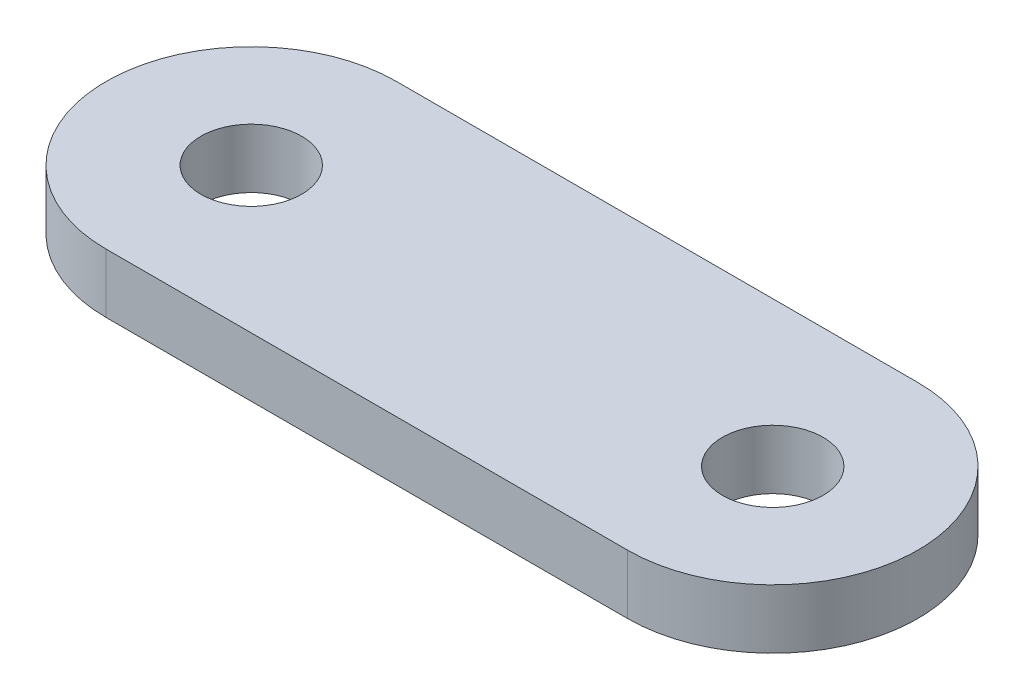
ISO-10303-21;
HEADER;
FILE_DESCRIPTION(('STEP AP214'),'2;1');
FILE_NAME('part.step','',(''),(''),'','','');
FILE_SCHEMA(('AUTOMOTIVE_DESIGN { 1 0 10303 214 1 1 1 1 }'));
ENDSEC;
DATA;
#1=APPLICATION_CONTEXT('core data for automotive mechanical design processes');
#2=APPLICATION_PROTOCOL_DEFINITION('international standard','automotive_design',2000,#1);
#3=PRODUCT_CONTEXT('',#1,'mechanical');
#4=PRODUCT('Part','Part','',(#3));
#5=PRODUCT_RELATED_PRODUCT_CATEGORY('part','',(#4));
#6=PRODUCT_DEFINITION_FORMATION('','',#4);
#7=PRODUCT_DEFINITION_CONTEXT('part definition',#1,'design');
#8=PRODUCT_DEFINITION('design','',#6,#7);
#9=PRODUCT_DEFINITION_SHAPE('','',#8);
#10=(LENGTH_UNIT() NAMED_UNIT(*) SI_UNIT(.MILLI.,.METRE.));
#11=(NAMED_UNIT(*) PLANE_ANGLE_UNIT() SI_UNIT($,.RADIAN.));
#12=(NAMED_UNIT(*) SI_UNIT($,.STERADIAN.) SOLID_ANGLE_UNIT());
#13=UNCERTAINTY_MEASURE_WITH_UNIT(LENGTH_MEASURE(1.E-05),#10,'distance_accuracy_value','');
#14=(GEOMETRIC_REPRESENTATION_CONTEXT(3) GLOBAL_UNCERTAINTY_ASSIGNED_CONTEXT((#13)) GLOBAL_UNIT_ASSIGNED_CONTEXT((#10,
#11,#12)) REPRESENTATION_CONTEXT('',''));
#15=CARTESIAN_POINT('',(0.,0.,0.));
#16=DIRECTION('',(0.,0.,1.));
#17=DIRECTION('',(1.,0.,0.));
#18=AXIS2_PLACEMENT_3D('',#15,#16,#17);
#19=CARTESIAN_POINT('',(0.,2.,0.));
#20=DIRECTION('',(0.,1.,0.));
#21=DIRECTION('',(0.,0.,1.));
#22=AXIS2_PLACEMENT_3D('',#19,#20,#21);
#23=PLANE('',#22);
#24=CARTESIAN_POINT('',(0.,2.,0.));
#25=DIRECTION('',(0.,1.,0.));
#26=DIRECTION('',(0.,0.,1.));
#27=AXIS2_PLACEMENT_3D('',#24,#25,#26);
#28=CIRCLE('',#27,1.7);
#29=CARTESIAN_POINT('',(0.,2.,1.7));
#30=VERTEX_POINT('',#29);
#31=EDGE_CURVE('E100',#30,#30,#28,.T.);
#32=ORIENTED_EDGE('',*,*,#31,.F.);
#33=EDGE_LOOP('',(#32));
#34=FACE_BOUND('',#33,.T.);
#35=CARTESIAN_POINT('',(0.,2.,0.));
#36=DIRECTION('',(0.,1.,0.));
#37=DIRECTION('',(0.,0.,1.));
#38=AXIS2_PLACEMENT_3D('',#35,#36,#37);
#39=CIRCLE('',#38,4.9);
#40=CARTESIAN_POINT('',(0.,2.,-4.9));
#41=VERTEX_POINT('',#40);
#42=CARTESIAN_POINT('',(0.,2.,4.9));
#43=VERTEX_POINT('',#42);
#44=EDGE_CURVE('E85',#41,#43,#39,.T.);
#45=ORIENTED_EDGE('',*,*,#44,.T.);
#46=DIRECTION('',(1.,0.,0.));
#47=VECTOR('',#46,1.);
#48=CARTESIAN_POINT('',(0.,2.,4.9));
#49=LINE('',#48,#47);
#50=CARTESIAN_POINT('',(17.6,2.,4.9));
#51=VERTEX_POINT('',#50);
#52=EDGE_CURVE('E80',#43,#51,#49,.T.);
#53=ORIENTED_EDGE('',*,*,#52,.T.);
#54=CARTESIAN_POINT('',(17.6,2.,0.));
#55=DIRECTION('',(0.,1.,0.));
#56=DIRECTION('',(0.,0.,1.));
#57=AXIS2_PLACEMENT_3D('',#54,#55,#56);
#58=CIRCLE('',#57,4.9);
#59=CARTESIAN_POINT('',(17.6,2.,-4.9));
#60=VERTEX_POINT('',#59);
#61=EDGE_CURVE('E83',#51,#60,#58,.T.);
#62=ORIENTED_EDGE('',*,*,#61,.T.);
#63=DIRECTION('',(-1.,0.,0.));
#64=VECTOR('',#63,1.);
#65=CARTESIAN_POINT('',(0.,2.,-4.9));
#66=LINE('',#65,#64);
#67=EDGE_CURVE('E50',#60,#41,#66,.T.);
#68=ORIENTED_EDGE('',*,*,#67,.T.);
#69=EDGE_LOOP('',(#45,#53,#62,#68));
#70=FACE_BOUND('',#69,.T.);
#71=CARTESIAN_POINT('',(17.6,2.,0.));
#72=DIRECTION('',(0.,1.,0.));
#73=DIRECTION('',(0.,0.,1.));
#74=AXIS2_PLACEMENT_3D('',#71,#72,#73);
#75=CIRCLE('',#74,1.7);
#76=CARTESIAN_POINT('',(17.6,2.,1.7));
#77=VERTEX_POINT('',#76);
#78=EDGE_CURVE('E115',#77,#77,#75,.T.);
#79=ORIENTED_EDGE('',*,*,#78,.F.);
#80=EDGE_LOOP('',(#79));
#81=FACE_BOUND('',#80,.T.);
#82=ADVANCED_FACE('F33',(#34,#70,#81),#23,.T.);
#83=CARTESIAN_POINT('',(0.,0.,0.));
#84=DIRECTION('',(0.,1.,0.));
#85=DIRECTION('',(0.,0.,1.));
#86=AXIS2_PLACEMENT_3D('',#83,#84,#85);
#87=PLANE('',#86);
#88=CARTESIAN_POINT('',(0.,0.,0.));
#89=DIRECTION('',(0.,1.,0.));
#90=DIRECTION('',(0.,0.,1.));
#91=AXIS2_PLACEMENT_3D('',#88,#89,#90);
#92=CIRCLE('',#91,4.9);
#93=CARTESIAN_POINT('',(0.,0.,-4.9));
#94=VERTEX_POINT('',#93);
#95=CARTESIAN_POINT('',(0.,0.,4.9));
#96=VERTEX_POINT('',#95);
#97=EDGE_CURVE('E97',#94,#96,#92,.T.);
#98=ORIENTED_EDGE('',*,*,#97,.F.);
#99=DIRECTION('',(-1.,0.,0.));
#100=VECTOR('',#99,1.);
#101=CARTESIAN_POINT('',(0.,0.,-4.9));
#102=LINE('',#101,#100);
#103=CARTESIAN_POINT('',(17.6,0.,-4.9));
#104=VERTEX_POINT('',#103);
#105=EDGE_CURVE('E73',#104,#94,#102,.T.);
#106=ORIENTED_EDGE('',*,*,#105,.F.);
#107=CARTESIAN_POINT('',(17.6,0.,0.));
#108=DIRECTION('',(0.,1.,0.));
#109=DIRECTION('',(0.,0.,1.));
#110=AXIS2_PLACEMENT_3D('',#107,#108,#109);
#111=CIRCLE('',#110,4.9);
#112=CARTESIAN_POINT('',(17.6,0.,4.9));
#113=VERTEX_POINT('',#112);
#114=EDGE_CURVE('E67',#113,#104,#111,.T.);
#115=ORIENTED_EDGE('',*,*,#114,.F.);
#116=DIRECTION('',(1.,0.,0.));
#117=VECTOR('',#116,1.);
#118=CARTESIAN_POINT('',(0.,0.,4.9));
#119=LINE('',#118,#117);
#120=EDGE_CURVE('E89',#96,#113,#119,.T.);
#121=ORIENTED_EDGE('',*,*,#120,.F.);
#122=EDGE_LOOP('',(#98,#106,#115,#121));
#123=FACE_BOUND('',#122,.T.);
#124=CARTESIAN_POINT('',(0.,0.,0.));
#125=DIRECTION('',(0.,1.,0.));
#126=DIRECTION('',(0.,0.,1.));
#127=AXIS2_PLACEMENT_3D('',#124,#125,#126);
#128=CIRCLE('',#127,1.7);
#129=CARTESIAN_POINT('',(0.,0.,1.7));
#130=VERTEX_POINT('',#129);
#131=EDGE_CURVE('E112',#130,#130,#128,.T.);
#132=ORIENTED_EDGE('',*,*,#131,.T.);
#133=EDGE_LOOP('',(#132));
#134=FACE_BOUND('',#133,.T.);
#135=CARTESIAN_POINT('',(17.6,0.,0.));
#136=DIRECTION('',(0.,1.,0.));
#137=DIRECTION('',(0.,0.,1.));
#138=AXIS2_PLACEMENT_3D('',#135,#136,#137);
#139=CIRCLE('',#138,1.7);
#140=CARTESIAN_POINT('',(17.6,0.,1.7));
#141=VERTEX_POINT('',#140);
#142=EDGE_CURVE('E118',#141,#141,#139,.T.);
#143=ORIENTED_EDGE('',*,*,#142,.T.);
#144=EDGE_LOOP('',(#143));
#145=FACE_BOUND('',#144,.T.);
#146=ADVANCED_FACE('F108',(#123,#134,#145),#87,.F.);
#147=CARTESIAN_POINT('',(0.,2.,0.));
#148=DIRECTION('',(0.,-1.,0.));
#149=DIRECTION('',(0.,0.,-1.));
#150=AXIS2_PLACEMENT_3D('',#147,#148,#149);
#151=CYLINDRICAL_SURFACE('',#150,4.9);
#152=ORIENTED_EDGE('',*,*,#97,.T.);
#153=DIRECTION('',(0.,-1.,0.));
#154=VECTOR('',#153,1.);
#155=CARTESIAN_POINT('',(0.,2.,4.9));
#156=LINE('',#155,#154);
#157=EDGE_CURVE('E11',#43,#96,#156,.T.);
#158=ORIENTED_EDGE('',*,*,#157,.F.);
#159=ORIENTED_EDGE('',*,*,#44,.F.);
#160=DIRECTION('',(0.,-1.,0.));
#161=VECTOR('',#160,1.);
#162=CARTESIAN_POINT('',(0.,2.,-4.9));
#163=LINE('',#162,#161);
#164=EDGE_CURVE('E93',#41,#94,#163,.T.);
#165=ORIENTED_EDGE('',*,*,#164,.T.);
#166=EDGE_LOOP('',(#152,#158,#159,#165));
#167=FACE_BOUND('',#166,.T.);
#168=ADVANCED_FACE('F35',(#167),#151,.T.);
#169=CARTESIAN_POINT('',(0.,2.,4.9));
#170=DIRECTION('',(0.,0.,-1.));
#171=DIRECTION('',(-1.,0.,0.));
#172=AXIS2_PLACEMENT_3D('',#169,#170,#171);
#173=PLANE('',#172);
#174=ORIENTED_EDGE('',*,*,#120,.T.);
#175=DIRECTION('',(0.,-1.,0.));
#176=VECTOR('',#175,1.);
#177=CARTESIAN_POINT('',(17.6,2.,4.9));
#178=LINE('',#177,#176);
#179=EDGE_CURVE('E42',#51,#113,#178,.T.);
#180=ORIENTED_EDGE('',*,*,#179,.F.);
#181=ORIENTED_EDGE('',*,*,#52,.F.);
#182=ORIENTED_EDGE('',*,*,#157,.T.);
#183=EDGE_LOOP('',(#174,#180,#181,#182));
#184=FACE_BOUND('',#183,.T.);
#185=ADVANCED_FACE('F88',(#184),#173,.F.);
#186=CARTESIAN_POINT('',(17.6,2.,0.));
#187=DIRECTION('',(0.,-1.,0.));
#188=DIRECTION('',(0.,0.,-1.));
#189=AXIS2_PLACEMENT_3D('',#186,#187,#188);
#190=CYLINDRICAL_SURFACE('',#189,4.9);
#191=ORIENTED_EDGE('',*,*,#114,.T.);
#192=DIRECTION('',(0.,-1.,0.));
#193=VECTOR('',#192,1.);
#194=CARTESIAN_POINT('',(17.6,2.,-4.9));
#195=LINE('',#194,#193);
#196=EDGE_CURVE('E90',#60,#104,#195,.T.);
#197=ORIENTED_EDGE('',*,*,#196,.F.);
#198=ORIENTED_EDGE('',*,*,#61,.F.);
#199=ORIENTED_EDGE('',*,*,#179,.T.);
#200=EDGE_LOOP('',(#191,#197,#198,#199));
#201=FACE_BOUND('',#200,.T.);
#202=ADVANCED_FACE('F91',(#201),#190,.T.);
#203=CARTESIAN_POINT('',(0.,2.,-4.9));
#204=DIRECTION('',(0.,0.,1.));
#205=DIRECTION('',(1.,0.,0.));
#206=AXIS2_PLACEMENT_3D('',#203,#204,#205);
#207=PLANE('',#206);
#208=ORIENTED_EDGE('',*,*,#105,.T.);
#209=ORIENTED_EDGE('',*,*,#164,.F.);
#210=ORIENTED_EDGE('',*,*,#67,.F.);
#211=ORIENTED_EDGE('',*,*,#196,.T.);
#212=EDGE_LOOP('',(#208,#209,#210,#211));
#213=FACE_BOUND('',#212,.T.);
#214=ADVANCED_FACE('F105',(#213),#207,.F.);
#215=CARTESIAN_POINT('',(0.,2.,0.));
#216=DIRECTION('',(0.,-1.,0.));
#217=DIRECTION('',(0.,0.,-1.));
#218=AXIS2_PLACEMENT_3D('',#215,#216,#217);
#219=CYLINDRICAL_SURFACE('',#218,1.7);
#220=ORIENTED_EDGE('',*,*,#31,.T.);
#221=EDGE_LOOP('',(#220));
#222=FACE_BOUND('',#221,.T.);
#223=ORIENTED_EDGE('',*,*,#131,.F.);
#224=EDGE_LOOP('',(#223));
#225=FACE_BOUND('',#224,.T.);
#226=ADVANCED_FACE('F135',(#222,#225),#219,.F.);
#227=CARTESIAN_POINT('',(17.6,2.,0.));
#228=DIRECTION('',(0.,-1.,0.));
#229=DIRECTION('',(0.,0.,-1.));
#230=AXIS2_PLACEMENT_3D('',#227,#228,#229);
#231=CYLINDRICAL_SURFACE('',#230,1.7);
#232=ORIENTED_EDGE('',*,*,#78,.T.);
#233=EDGE_LOOP('',(#232));
#234=FACE_BOUND('',#233,.T.);
#235=ORIENTED_EDGE('',*,*,#142,.F.);
#236=EDGE_LOOP('',(#235));
#237=FACE_BOUND('',#236,.T.);
#238=ADVANCED_FACE('F124',(#234,#237),#231,.F.);
#239=CLOSED_SHELL('',(#82,#146,#168,#185,#202,#214,#226,#238));
#240=MANIFOLD_SOLID_BREP('B2',#239);
#241=ADVANCED_BREP_SHAPE_REPRESENTATION('',(#18,#240),#14);
#242=SHAPE_DEFINITION_REPRESENTATION(#9,#241);
ENDSEC;
END-ISO-10303-21;
